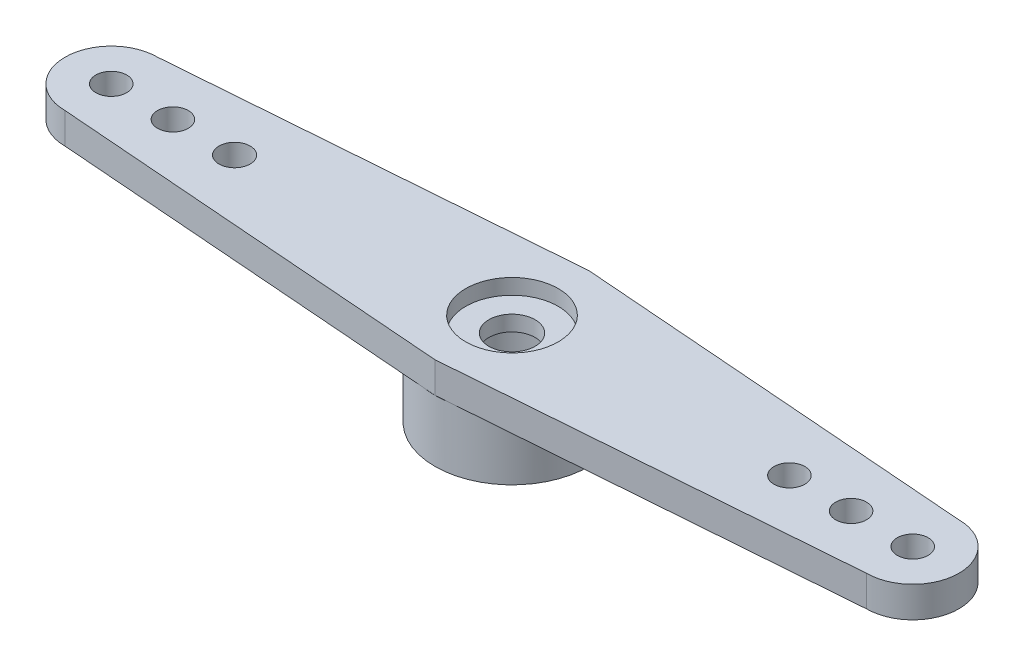
ISO-10303-21;
HEADER;
FILE_DESCRIPTION(('STEP AP214'),'2;1');
FILE_NAME('part.step','',(''),(''),'','','');
FILE_SCHEMA(('AUTOMOTIVE_DESIGN { 1 0 10303 214 1 1 1 1 }'));
ENDSEC;
DATA;
#1=APPLICATION_CONTEXT('core data for automotive mechanical design processes');
#2=APPLICATION_PROTOCOL_DEFINITION('international standard','automotive_design',2000,#1);
#3=PRODUCT_CONTEXT('',#1,'mechanical');
#4=PRODUCT('Part','Part','',(#3));
#5=PRODUCT_RELATED_PRODUCT_CATEGORY('part','',(#4));
#6=PRODUCT_DEFINITION_FORMATION('','',#4);
#7=PRODUCT_DEFINITION_CONTEXT('part definition',#1,'design');
#8=PRODUCT_DEFINITION('design','',#6,#7);
#9=PRODUCT_DEFINITION_SHAPE('','',#8);
#10=(LENGTH_UNIT() NAMED_UNIT(*) SI_UNIT(.MILLI.,.METRE.));
#11=(NAMED_UNIT(*) PLANE_ANGLE_UNIT() SI_UNIT($,.RADIAN.));
#12=(NAMED_UNIT(*) SI_UNIT($,.STERADIAN.) SOLID_ANGLE_UNIT());
#13=UNCERTAINTY_MEASURE_WITH_UNIT(LENGTH_MEASURE(1.E-05),#10,'distance_accuracy_value','');
#14=(GEOMETRIC_REPRESENTATION_CONTEXT(3) GLOBAL_UNCERTAINTY_ASSIGNED_CONTEXT((#13)) GLOBAL_UNIT_ASSIGNED_CONTEXT((#10,
#11,#12)) REPRESENTATION_CONTEXT('',''));
#15=CARTESIAN_POINT('',(0.,0.,0.));
#16=DIRECTION('',(0.,0.,1.));
#17=DIRECTION('',(1.,0.,0.));
#18=AXIS2_PLACEMENT_3D('',#15,#16,#17);
#19=CARTESIAN_POINT('',(0.,2.,0.));
#20=DIRECTION('',(0.,-1.,0.));
#21=DIRECTION('',(0.,0.,-1.));
#22=AXIS2_PLACEMENT_3D('',#19,#20,#21);
#23=CYLINDRICAL_SURFACE('',#22,0.75);
#24=CARTESIAN_POINT('',(0.,0.,0.));
#25=DIRECTION('',(0.,1.,0.));
#26=DIRECTION('',(0.,0.,1.));
#27=AXIS2_PLACEMENT_3D('',#24,#25,#26);
#28=CIRCLE('',#27,0.75);
#29=CARTESIAN_POINT('',(0.,0.,0.75));
#30=VERTEX_POINT('',#29);
#31=EDGE_CURVE('E174',#30,#30,#28,.T.);
#32=ORIENTED_EDGE('',*,*,#31,.F.);
#33=EDGE_LOOP('',(#32));
#34=FACE_BOUND('',#33,.T.);
#35=CARTESIAN_POINT('',(0.,0.5,0.));
#36=DIRECTION('',(0.,1.,0.));
#37=DIRECTION('',(0.,0.,1.));
#38=AXIS2_PLACEMENT_3D('',#35,#36,#37);
#39=CIRCLE('',#38,0.75);
#40=CARTESIAN_POINT('',(0.,0.5,0.75));
#41=VERTEX_POINT('',#40);
#42=EDGE_CURVE('E167',#41,#41,#39,.T.);
#43=ORIENTED_EDGE('',*,*,#42,.T.);
#44=EDGE_LOOP('',(#43));
#45=FACE_BOUND('',#44,.T.);
#46=ADVANCED_FACE('F41',(#34,#45),#23,.F.);
#47=CARTESIAN_POINT('',(0.,0.,0.));
#48=DIRECTION('',(0.,1.,0.));
#49=DIRECTION('',(0.,0.,1.));
#50=AXIS2_PLACEMENT_3D('',#47,#48,#49);
#51=PLANE('',#50);
#52=CARTESIAN_POINT('',(13.,0.,0.));
#53=DIRECTION('',(0.,1.,0.));
#54=DIRECTION('',(0.,0.,1.));
#55=AXIS2_PLACEMENT_3D('',#52,#53,#54);
#56=CIRCLE('',#55,0.500000000000001);
#57=CARTESIAN_POINT('',(13.,0.,0.499999999999996));
#58=VERTEX_POINT('',#57);
#59=EDGE_CURVE('E581',#58,#58,#56,.T.);
#60=ORIENTED_EDGE('',*,*,#59,.T.);
#61=EDGE_LOOP('',(#60));
#62=FACE_BOUND('',#61,.T.);
#63=CARTESIAN_POINT('',(11.,0.,0.));
#64=DIRECTION('',(0.,1.,0.));
#65=DIRECTION('',(0.,0.,1.));
#66=AXIS2_PLACEMENT_3D('',#63,#64,#65);
#67=CIRCLE('',#66,0.500000000000001);
#68=CARTESIAN_POINT('',(11.,0.,0.500000000000001));
#69=VERTEX_POINT('',#68);
#70=EDGE_CURVE('E281',#69,#69,#67,.T.);
#71=ORIENTED_EDGE('',*,*,#70,.T.);
#72=EDGE_LOOP('',(#71));
#73=FACE_BOUND('',#72,.T.);
#74=CARTESIAN_POINT('',(9.,0.,0.));
#75=DIRECTION('',(0.,1.,0.));
#76=DIRECTION('',(0.,0.,1.));
#77=AXIS2_PLACEMENT_3D('',#74,#75,#76);
#78=CIRCLE('',#77,0.500000000000001);
#79=CARTESIAN_POINT('',(9.,0.,0.500000000000001));
#80=VERTEX_POINT('',#79);
#81=EDGE_CURVE('E582',#80,#80,#78,.T.);
#82=ORIENTED_EDGE('',*,*,#81,.T.);
#83=EDGE_LOOP('',(#82));
#84=FACE_BOUND('',#83,.T.);
#85=DIRECTION('',(-0.997054485501582,0.,0.0766964988847373));
#86=VECTOR('',#85,1.);
#87=CARTESIAN_POINT('',(0.191176470588236,0.,2.48529411764706));
#88=LINE('',#87,#86);
#89=CARTESIAN_POINT('',(13.,0.,1.5));
#90=VERTEX_POINT('',#89);
#91=CARTESIAN_POINT('',(0.382352941176476,0.,2.47058823529412));
#92=VERTEX_POINT('',#91);
#93=EDGE_CURVE('E119',#90,#92,#88,.T.);
#94=ORIENTED_EDGE('',*,*,#93,.T.);
#95=CARTESIAN_POINT('',(0.,0.,0.));
#96=DIRECTION('',(0.,1.,0.));
#97=DIRECTION('',(0.,0.,1.));
#98=AXIS2_PLACEMENT_3D('',#95,#96,#97);
#99=CIRCLE('',#98,2.5);
#100=CARTESIAN_POINT('',(0.382352941176478,0.,-2.47058823529412));
#101=VERTEX_POINT('',#100);
#102=EDGE_CURVE('E11',#92,#101,#99,.T.);
#103=ORIENTED_EDGE('',*,*,#102,.T.);
#104=DIRECTION('',(0.997054485501582,0.,0.0766964988847366));
#105=VECTOR('',#104,1.);
#106=CARTESIAN_POINT('',(0.191176470588234,0.,-2.48529411764706));
#107=LINE('',#106,#105);
#108=CARTESIAN_POINT('',(13.,0.,-1.50000000000001));
#109=VERTEX_POINT('',#108);
#110=EDGE_CURVE('E90',#101,#109,#107,.T.);
#111=ORIENTED_EDGE('',*,*,#110,.T.);
#112=CARTESIAN_POINT('',(13.,0.,0.));
#113=DIRECTION('',(0.,1.,0.));
#114=DIRECTION('',(0.,0.,1.));
#115=AXIS2_PLACEMENT_3D('',#112,#113,#114);
#116=CIRCLE('',#115,1.5);
#117=EDGE_CURVE('E153',#90,#109,#116,.T.);
#118=ORIENTED_EDGE('',*,*,#117,.F.);
#119=EDGE_LOOP('',(#94,#103,#111,#118));
#120=FACE_BOUND('',#119,.T.);
#121=ADVANCED_FACE('F239',(#62,#73,#84,#120),#51,.F.);
#122=CARTESIAN_POINT('',(-0.191176470588235,1.,-2.48529411764706));
#123=DIRECTION('',(0.0766964988847371,0.,0.997054485501582));
#124=DIRECTION('',(0.997054485501582,0.,-0.0766964988847371));
#125=AXIS2_PLACEMENT_3D('',#122,#123,#124);
#126=PLANE('',#125);
#127=DIRECTION('',(-0.997054485501582,0.,0.0766964988847371));
#128=VECTOR('',#127,1.);
#129=CARTESIAN_POINT('',(-0.191176470588235,0.,-2.48529411764706));
#130=LINE('',#129,#128);
#131=CARTESIAN_POINT('',(0.,0.,-2.5));
#132=VERTEX_POINT('',#131);
#133=CARTESIAN_POINT('',(-0.382352941176479,0.,-2.47058823529412));
#134=VERTEX_POINT('',#133);
#135=EDGE_CURVE('E141',#132,#134,#130,.T.);
#136=ORIENTED_EDGE('',*,*,#135,.T.);
#137=CARTESIAN_POINT('',(-13.,0.,-1.5));
#138=VERTEX_POINT('',#137);
#139=EDGE_CURVE('E145',#134,#138,#130,.T.);
#140=ORIENTED_EDGE('',*,*,#139,.T.);
#141=DIRECTION('',(0.,-1.,0.));
#142=VECTOR('',#141,1.);
#143=CARTESIAN_POINT('',(-13.,1.,-1.5));
#144=LINE('',#143,#142);
#145=CARTESIAN_POINT('',(-13.,1.,-1.5));
#146=VERTEX_POINT('',#145);
#147=EDGE_CURVE('E165',#146,#138,#144,.T.);
#148=ORIENTED_EDGE('',*,*,#147,.F.);
#149=DIRECTION('',(-0.997054485501582,0.,0.0766964988847371));
#150=VECTOR('',#149,1.);
#151=CARTESIAN_POINT('',(-0.191176470588235,1.,-2.48529411764706));
#152=LINE('',#151,#150);
#153=CARTESIAN_POINT('',(0.,1.,-2.5));
#154=VERTEX_POINT('',#153);
#155=EDGE_CURVE('E158',#154,#146,#152,.T.);
#156=ORIENTED_EDGE('',*,*,#155,.F.);
#157=DIRECTION('',(0.,-1.,0.));
#158=VECTOR('',#157,1.);
#159=CARTESIAN_POINT('',(0.,1.,-2.5));
#160=LINE('',#159,#158);
#161=EDGE_CURVE('E68',#154,#132,#160,.T.);
#162=ORIENTED_EDGE('',*,*,#161,.T.);
#163=EDGE_LOOP('',(#136,#140,#148,#156,#162));
#164=FACE_BOUND('',#163,.T.);
#165=ADVANCED_FACE('F43',(#164),#126,.F.);
#166=CARTESIAN_POINT('',(-13.,1.,0.));
#167=DIRECTION('',(0.,-1.,0.));
#168=DIRECTION('',(0.,0.,-1.));
#169=AXIS2_PLACEMENT_3D('',#166,#167,#168);
#170=CYLINDRICAL_SURFACE('',#169,1.5);
#171=CARTESIAN_POINT('',(-13.,0.,0.));
#172=DIRECTION('',(0.,1.,0.));
#173=DIRECTION('',(0.,0.,1.));
#174=AXIS2_PLACEMENT_3D('',#171,#172,#173);
#175=CIRCLE('',#174,1.5);
#176=CARTESIAN_POINT('',(-13.,0.,1.5));
#177=VERTEX_POINT('',#176);
#178=EDGE_CURVE('E144',#138,#177,#175,.T.);
#179=ORIENTED_EDGE('',*,*,#178,.T.);
#180=DIRECTION('',(0.,-1.,0.));
#181=VECTOR('',#180,1.);
#182=CARTESIAN_POINT('',(-13.,1.,1.5));
#183=LINE('',#182,#181);
#184=CARTESIAN_POINT('',(-13.,1.,1.5));
#185=VERTEX_POINT('',#184);
#186=EDGE_CURVE('E162',#185,#177,#183,.T.);
#187=ORIENTED_EDGE('',*,*,#186,.F.);
#188=CARTESIAN_POINT('',(-13.,1.,0.));
#189=DIRECTION('',(0.,1.,0.));
#190=DIRECTION('',(0.,0.,1.));
#191=AXIS2_PLACEMENT_3D('',#188,#189,#190);
#192=CIRCLE('',#191,1.5);
#193=EDGE_CURVE('E99',#146,#185,#192,.T.);
#194=ORIENTED_EDGE('',*,*,#193,.F.);
#195=ORIENTED_EDGE('',*,*,#147,.T.);
#196=EDGE_LOOP('',(#179,#187,#194,#195));
#197=FACE_BOUND('',#196,.T.);
#198=ADVANCED_FACE('F206',(#197),#170,.T.);
#199=CARTESIAN_POINT('',(-0.191176470588235,1.,2.48529411764706));
#200=DIRECTION('',(-0.0766964988847371,0.,0.997054485501582));
#201=DIRECTION('',(0.997054485501582,0.,0.0766964988847371));
#202=AXIS2_PLACEMENT_3D('',#199,#200,#201);
#203=PLANE('',#202);
#204=DIRECTION('',(-0.997054485501582,0.,-0.0766964988847371));
#205=VECTOR('',#204,1.);
#206=CARTESIAN_POINT('',(-0.191176470588235,0.,2.48529411764706));
#207=LINE('',#206,#205);
#208=CARTESIAN_POINT('',(0.,0.,2.5));
#209=VERTEX_POINT('',#208);
#210=CARTESIAN_POINT('',(-0.382352941176479,0.,2.47058823529412));
#211=VERTEX_POINT('',#210);
#212=EDGE_CURVE('E149',#209,#211,#207,.T.);
#213=ORIENTED_EDGE('',*,*,#212,.F.);
#214=DIRECTION('',(0.,-1.,0.));
#215=VECTOR('',#214,1.);
#216=CARTESIAN_POINT('',(0.,1.,2.5));
#217=LINE('',#216,#215);
#218=CARTESIAN_POINT('',(0.,1.,2.5));
#219=VERTEX_POINT('',#218);
#220=EDGE_CURVE('E122',#219,#209,#217,.T.);
#221=ORIENTED_EDGE('',*,*,#220,.F.);
#222=DIRECTION('',(-0.997054485501582,0.,-0.0766964988847371));
#223=VECTOR('',#222,1.);
#224=CARTESIAN_POINT('',(-0.191176470588235,1.,2.48529411764706));
#225=LINE('',#224,#223);
#226=EDGE_CURVE('E135',#219,#185,#225,.T.);
#227=ORIENTED_EDGE('',*,*,#226,.T.);
#228=ORIENTED_EDGE('',*,*,#186,.T.);
#229=EDGE_CURVE('E148',#211,#177,#207,.T.);
#230=ORIENTED_EDGE('',*,*,#229,.F.);
#231=EDGE_LOOP('',(#213,#221,#227,#228,#230));
#232=FACE_BOUND('',#231,.T.);
#233=ADVANCED_FACE('F211',(#232),#203,.T.);
#234=CARTESIAN_POINT('',(0.191176470588236,1.,2.48529411764706));
#235=DIRECTION('',(0.0766964988847373,0.,0.997054485501581));
#236=DIRECTION('',(0.997054485501582,0.,-0.0766964988847373));
#237=AXIS2_PLACEMENT_3D('',#234,#235,#236);
#238=PLANE('',#237);
#239=ORIENTED_EDGE('',*,*,#93,.F.);
#240=DIRECTION('',(0.,-1.,0.));
#241=VECTOR('',#240,1.);
#242=CARTESIAN_POINT('',(13.,1.,1.5));
#243=LINE('',#242,#241);
#244=CARTESIAN_POINT('',(13.,1.,1.5));
#245=VERTEX_POINT('',#244);
#246=EDGE_CURVE('E111',#245,#90,#243,.T.);
#247=ORIENTED_EDGE('',*,*,#246,.F.);
#248=DIRECTION('',(-0.997054485501582,0.,0.0766964988847373));
#249=VECTOR('',#248,1.);
#250=CARTESIAN_POINT('',(0.191176470588236,1.,2.48529411764706));
#251=LINE('',#250,#249);
#252=EDGE_CURVE('E116',#245,#219,#251,.T.);
#253=ORIENTED_EDGE('',*,*,#252,.T.);
#254=ORIENTED_EDGE('',*,*,#220,.T.);
#255=EDGE_CURVE('E151',#92,#209,#88,.T.);
#256=ORIENTED_EDGE('',*,*,#255,.F.);
#257=EDGE_LOOP('',(#239,#247,#253,#254,#256));
#258=FACE_BOUND('',#257,.T.);
#259=ADVANCED_FACE('F113',(#258),#238,.T.);
#260=CARTESIAN_POINT('',(13.,1.,0.));
#261=DIRECTION('',(0.,-1.,0.));
#262=DIRECTION('',(0.,0.,-1.));
#263=AXIS2_PLACEMENT_3D('',#260,#261,#262);
#264=CYLINDRICAL_SURFACE('',#263,1.5);
#265=ORIENTED_EDGE('',*,*,#117,.T.);
#266=DIRECTION('',(0.,-1.,0.));
#267=VECTOR('',#266,1.);
#268=CARTESIAN_POINT('',(13.,1.,-1.50000000000001));
#269=LINE('',#268,#267);
#270=CARTESIAN_POINT('',(13.,1.,-1.50000000000001));
#271=VERTEX_POINT('',#270);
#272=EDGE_CURVE('E123',#271,#109,#269,.T.);
#273=ORIENTED_EDGE('',*,*,#272,.F.);
#274=CARTESIAN_POINT('',(13.,1.,0.));
#275=DIRECTION('',(0.,1.,0.));
#276=DIRECTION('',(0.,0.,1.));
#277=AXIS2_PLACEMENT_3D('',#274,#275,#276);
#278=CIRCLE('',#277,1.5);
#279=EDGE_CURVE('E126',#245,#271,#278,.T.);
#280=ORIENTED_EDGE('',*,*,#279,.F.);
#281=ORIENTED_EDGE('',*,*,#246,.T.);
#282=EDGE_LOOP('',(#265,#273,#280,#281));
#283=FACE_BOUND('',#282,.T.);
#284=ADVANCED_FACE('F127',(#283),#264,.T.);
#285=CARTESIAN_POINT('',(0.191176470588234,1.,-2.48529411764706));
#286=DIRECTION('',(0.0766964988847366,0.,-0.997054485501582));
#287=DIRECTION('',(-0.997054485501582,0.,-0.0766964988847366));
#288=AXIS2_PLACEMENT_3D('',#285,#286,#287);
#289=PLANE('',#288);
#290=EDGE_CURVE('E155',#132,#101,#107,.T.);
#291=ORIENTED_EDGE('',*,*,#290,.F.);
#292=ORIENTED_EDGE('',*,*,#161,.F.);
#293=DIRECTION('',(0.997054485501582,0.,0.0766964988847366));
#294=VECTOR('',#293,1.);
#295=CARTESIAN_POINT('',(0.191176470588234,1.,-2.48529411764706));
#296=LINE('',#295,#294);
#297=EDGE_CURVE('E130',#154,#271,#296,.T.);
#298=ORIENTED_EDGE('',*,*,#297,.T.);
#299=ORIENTED_EDGE('',*,*,#272,.T.);
#300=ORIENTED_EDGE('',*,*,#110,.F.);
#301=EDGE_LOOP('',(#291,#292,#298,#299,#300));
#302=FACE_BOUND('',#301,.T.);
#303=ADVANCED_FACE('F236',(#302),#289,.T.);
#304=CARTESIAN_POINT('',(0.,1.,0.));
#305=DIRECTION('',(0.,1.,0.));
#306=DIRECTION('',(0.,0.,1.));
#307=AXIS2_PLACEMENT_3D('',#304,#305,#306);
#308=PLANE('',#307);
#309=CARTESIAN_POINT('',(-11.,1.,0.));
#310=DIRECTION('',(0.,1.,0.));
#311=DIRECTION('',(0.,0.,1.));
#312=AXIS2_PLACEMENT_3D('',#309,#310,#311);
#313=CIRCLE('',#312,0.500000000000001);
#314=CARTESIAN_POINT('',(-11.,1.,0.500000000000001));
#315=VERTEX_POINT('',#314);
#316=EDGE_CURVE('E178',#315,#315,#313,.F.);
#317=ORIENTED_EDGE('',*,*,#316,.T.);
#318=EDGE_LOOP('',(#317));
#319=FACE_BOUND('',#318,.T.);
#320=CARTESIAN_POINT('',(-13.,1.,0.));
#321=DIRECTION('',(0.,1.,0.));
#322=DIRECTION('',(0.,0.,1.));
#323=AXIS2_PLACEMENT_3D('',#320,#321,#322);
#324=CIRCLE('',#323,0.500000000000001);
#325=CARTESIAN_POINT('',(-13.,1.,0.500000000000001));
#326=VERTEX_POINT('',#325);
#327=EDGE_CURVE('E277',#326,#326,#324,.F.);
#328=ORIENTED_EDGE('',*,*,#327,.T.);
#329=EDGE_LOOP('',(#328));
#330=FACE_BOUND('',#329,.T.);
#331=CARTESIAN_POINT('',(13.,1.,0.));
#332=DIRECTION('',(0.,1.,0.));
#333=DIRECTION('',(0.,0.,1.));
#334=AXIS2_PLACEMENT_3D('',#331,#332,#333);
#335=CIRCLE('',#334,0.500000000000001);
#336=CARTESIAN_POINT('',(13.,1.,0.499999999999996));
#337=VERTEX_POINT('',#336);
#338=EDGE_CURVE('E45',#337,#337,#335,.F.);
#339=ORIENTED_EDGE('',*,*,#338,.T.);
#340=EDGE_LOOP('',(#339));
#341=FACE_BOUND('',#340,.T.);
#342=CARTESIAN_POINT('',(11.,1.,0.));
#343=DIRECTION('',(0.,1.,0.));
#344=DIRECTION('',(0.,0.,1.));
#345=AXIS2_PLACEMENT_3D('',#342,#343,#344);
#346=CIRCLE('',#345,0.500000000000001);
#347=CARTESIAN_POINT('',(11.,1.,0.500000000000001));
#348=VERTEX_POINT('',#347);
#349=EDGE_CURVE('E177',#348,#348,#346,.F.);
#350=ORIENTED_EDGE('',*,*,#349,.T.);
#351=EDGE_LOOP('',(#350));
#352=FACE_BOUND('',#351,.T.);
#353=CARTESIAN_POINT('',(9.,1.,0.));
#354=DIRECTION('',(0.,1.,0.));
#355=DIRECTION('',(0.,0.,1.));
#356=AXIS2_PLACEMENT_3D('',#353,#354,#355);
#357=CIRCLE('',#356,0.500000000000001);
#358=CARTESIAN_POINT('',(9.,1.,0.500000000000001));
#359=VERTEX_POINT('',#358);
#360=EDGE_CURVE('E175',#359,#359,#357,.F.);
#361=ORIENTED_EDGE('',*,*,#360,.T.);
#362=EDGE_LOOP('',(#361));
#363=FACE_BOUND('',#362,.T.);
#364=CARTESIAN_POINT('',(-9.,1.,0.));
#365=DIRECTION('',(0.,1.,0.));
#366=DIRECTION('',(0.,0.,1.));
#367=AXIS2_PLACEMENT_3D('',#364,#365,#366);
#368=CIRCLE('',#367,0.506721331634058);
#369=CARTESIAN_POINT('',(-9.,1.,0.506721331634058));
#370=VERTEX_POINT('',#369);
#371=EDGE_CURVE('E274',#370,#370,#368,.F.);
#372=ORIENTED_EDGE('',*,*,#371,.T.);
#373=EDGE_LOOP('',(#372));
#374=FACE_BOUND('',#373,.T.);
#375=CARTESIAN_POINT('',(0.,1.,0.));
#376=DIRECTION('',(0.,1.,0.));
#377=DIRECTION('',(0.,0.,1.));
#378=AXIS2_PLACEMENT_3D('',#375,#376,#377);
#379=CIRCLE('',#378,1.5);
#380=CARTESIAN_POINT('',(0.,1.,1.5));
#381=VERTEX_POINT('',#380);
#382=EDGE_CURVE('E170',#381,#381,#379,.F.);
#383=ORIENTED_EDGE('',*,*,#382,.T.);
#384=EDGE_LOOP('',(#383));
#385=FACE_BOUND('',#384,.T.);
#386=ORIENTED_EDGE('',*,*,#155,.T.);
#387=ORIENTED_EDGE('',*,*,#193,.T.);
#388=ORIENTED_EDGE('',*,*,#226,.F.);
#389=ORIENTED_EDGE('',*,*,#252,.F.);
#390=ORIENTED_EDGE('',*,*,#279,.T.);
#391=ORIENTED_EDGE('',*,*,#297,.F.);
#392=EDGE_LOOP('',(#386,#387,#388,#389,#390,#391));
#393=FACE_BOUND('',#392,.T.);
#394=ADVANCED_FACE('F133',(#319,#330,#341,#352,#363,#374,#385,#393),#308,.T.);
#395=CARTESIAN_POINT('',(-11.,0.,0.));
#396=DIRECTION('',(0.,1.,0.));
#397=DIRECTION('',(0.,0.,1.));
#398=AXIS2_PLACEMENT_3D('',#395,#396,#397);
#399=CIRCLE('',#398,0.500000000000001);
#400=CARTESIAN_POINT('',(-11.,0.,0.500000000000001));
#401=VERTEX_POINT('',#400);
#402=EDGE_CURVE('E265',#401,#401,#399,.T.);
#403=ORIENTED_EDGE('',*,*,#402,.T.);
#404=EDGE_LOOP('',(#403));
#405=FACE_BOUND('',#404,.T.);
#406=CARTESIAN_POINT('',(-13.,0.,0.));
#407=DIRECTION('',(0.,1.,0.));
#408=DIRECTION('',(0.,0.,1.));
#409=AXIS2_PLACEMENT_3D('',#406,#407,#408);
#410=CIRCLE('',#409,0.500000000000001);
#411=CARTESIAN_POINT('',(-13.,0.,0.500000000000001));
#412=VERTEX_POINT('',#411);
#413=EDGE_CURVE('E269',#412,#412,#410,.T.);
#414=ORIENTED_EDGE('',*,*,#413,.T.);
#415=EDGE_LOOP('',(#414));
#416=FACE_BOUND('',#415,.T.);
#417=CARTESIAN_POINT('',(-9.,0.,0.));
#418=DIRECTION('',(0.,1.,0.));
#419=DIRECTION('',(0.,0.,1.));
#420=AXIS2_PLACEMENT_3D('',#417,#418,#419);
#421=CIRCLE('',#420,0.506721331634058);
#422=CARTESIAN_POINT('',(-9.,0.,0.506721331634058));
#423=VERTEX_POINT('',#422);
#424=EDGE_CURVE('E272',#423,#423,#421,.T.);
#425=ORIENTED_EDGE('',*,*,#424,.T.);
#426=EDGE_LOOP('',(#425));
#427=FACE_BOUND('',#426,.T.);
#428=ORIENTED_EDGE('',*,*,#139,.F.);
#429=EDGE_CURVE('E50',#134,#211,#99,.T.);
#430=ORIENTED_EDGE('',*,*,#429,.T.);
#431=ORIENTED_EDGE('',*,*,#229,.T.);
#432=ORIENTED_EDGE('',*,*,#178,.F.);
#433=EDGE_LOOP('',(#428,#430,#431,#432));
#434=FACE_BOUND('',#433,.T.);
#435=ADVANCED_FACE('F234',(#405,#416,#427,#434),#51,.F.);
#436=CARTESIAN_POINT('',(0.,0.,0.));
#437=DIRECTION('',(0.,1.,0.));
#438=DIRECTION('',(0.,0.,1.));
#439=AXIS2_PLACEMENT_3D('',#436,#437,#438);
#440=PLANE('',#439);
#441=ORIENTED_EDGE('',*,*,#135,.F.);
#442=EDGE_CURVE('E229',#132,#134,#99,.T.);
#443=ORIENTED_EDGE('',*,*,#442,.T.);
#444=EDGE_LOOP('',(#441,#443));
#445=FACE_BOUND('',#444,.T.);
#446=ADVANCED_FACE('F233',(#445),#440,.T.);
#447=EDGE_CURVE('E52',#101,#132,#99,.T.);
#448=ORIENTED_EDGE('',*,*,#447,.T.);
#449=ORIENTED_EDGE('',*,*,#290,.T.);
#450=EDGE_LOOP('',(#448,#449));
#451=FACE_BOUND('',#450,.T.);
#452=ADVANCED_FACE('F238',(#451),#440,.T.);
#453=EDGE_CURVE('E202',#209,#92,#99,.T.);
#454=ORIENTED_EDGE('',*,*,#453,.T.);
#455=ORIENTED_EDGE('',*,*,#255,.T.);
#456=EDGE_LOOP('',(#454,#455));
#457=FACE_BOUND('',#456,.T.);
#458=ADVANCED_FACE('F338',(#457),#440,.T.);
#459=CARTESIAN_POINT('',(0.,-2.,0.));
#460=DIRECTION('',(0.,1.,0.));
#461=DIRECTION('',(0.,0.,1.));
#462=AXIS2_PLACEMENT_3D('',#459,#460,#461);
#463=CYLINDRICAL_SURFACE('',#462,2.5);
#464=CARTESIAN_POINT('',(0.,-2.,0.));
#465=DIRECTION('',(0.,1.,0.));
#466=DIRECTION('',(0.,0.,1.));
#467=AXIS2_PLACEMENT_3D('',#464,#465,#466);
#468=CIRCLE('',#467,2.5);
#469=CARTESIAN_POINT('',(0.,-2.,2.5));
#470=VERTEX_POINT('',#469);
#471=EDGE_CURVE('E200',#470,#470,#468,.T.);
#472=ORIENTED_EDGE('',*,*,#471,.T.);
#473=EDGE_LOOP('',(#472));
#474=FACE_BOUND('',#473,.T.);
#475=ORIENTED_EDGE('',*,*,#453,.F.);
#476=EDGE_CURVE('E59',#211,#209,#99,.T.);
#477=ORIENTED_EDGE('',*,*,#476,.F.);
#478=ORIENTED_EDGE('',*,*,#429,.F.);
#479=ORIENTED_EDGE('',*,*,#442,.F.);
#480=ORIENTED_EDGE('',*,*,#447,.F.);
#481=ORIENTED_EDGE('',*,*,#102,.F.);
#482=EDGE_LOOP('',(#475,#477,#478,#479,#480,#481));
#483=FACE_BOUND('',#482,.T.);
#484=ADVANCED_FACE('F227',(#474,#483),#463,.T.);
#485=CARTESIAN_POINT('',(0.,-2.,0.));
#486=DIRECTION('',(0.,1.,0.));
#487=DIRECTION('',(0.,0.,1.));
#488=AXIS2_PLACEMENT_3D('',#485,#486,#487);
#489=PLANE('',#488);
#490=CARTESIAN_POINT('',(0.,-2.,0.));
#491=DIRECTION('',(0.,1.,0.));
#492=DIRECTION('',(0.,0.,1.));
#493=AXIS2_PLACEMENT_3D('',#490,#491,#492);
#494=CIRCLE('',#493,1.5);
#495=CARTESIAN_POINT('',(0.,-2.,1.5));
#496=VERTEX_POINT('',#495);
#497=EDGE_CURVE('E195',#496,#496,#494,.T.);
#498=ORIENTED_EDGE('',*,*,#497,.T.);
#499=EDGE_LOOP('',(#498));
#500=FACE_BOUND('',#499,.T.);
#501=ORIENTED_EDGE('',*,*,#471,.F.);
#502=EDGE_LOOP('',(#501));
#503=FACE_BOUND('',#502,.T.);
#504=ADVANCED_FACE('F332',(#500,#503),#489,.F.);
#505=ORIENTED_EDGE('',*,*,#476,.T.);
#506=ORIENTED_EDGE('',*,*,#212,.T.);
#507=EDGE_LOOP('',(#505,#506));
#508=FACE_BOUND('',#507,.T.);
#509=ADVANCED_FACE('F260',(#508),#440,.T.);
#510=CARTESIAN_POINT('',(0.,-2.,0.));
#511=DIRECTION('',(0.,1.,0.));
#512=DIRECTION('',(0.,0.,1.));
#513=AXIS2_PLACEMENT_3D('',#510,#511,#512);
#514=CYLINDRICAL_SURFACE('',#513,1.5);
#515=ORIENTED_EDGE('',*,*,#497,.F.);
#516=EDGE_LOOP('',(#515));
#517=FACE_BOUND('',#516,.T.);
#518=CARTESIAN_POINT('',(0.,0.,0.));
#519=DIRECTION('',(0.,1.,0.));
#520=DIRECTION('',(0.,0.,1.));
#521=AXIS2_PLACEMENT_3D('',#518,#519,#520);
#522=CIRCLE('',#521,1.5);
#523=CARTESIAN_POINT('',(0.,0.,1.5));
#524=VERTEX_POINT('',#523);
#525=EDGE_CURVE('E194',#524,#524,#522,.T.);
#526=ORIENTED_EDGE('',*,*,#525,.T.);
#527=EDGE_LOOP('',(#526));
#528=FACE_BOUND('',#527,.T.);
#529=ADVANCED_FACE('F327',(#517,#528),#514,.F.);
#530=CARTESIAN_POINT('',(0.,0.,0.));
#531=DIRECTION('',(0.,1.,0.));
#532=DIRECTION('',(0.,0.,1.));
#533=AXIS2_PLACEMENT_3D('',#530,#531,#532);
#534=PLANE('',#533);
#535=ORIENTED_EDGE('',*,*,#31,.T.);
#536=EDGE_LOOP('',(#535));
#537=FACE_BOUND('',#536,.T.);
#538=ORIENTED_EDGE('',*,*,#525,.F.);
#539=EDGE_LOOP('',(#538));
#540=FACE_BOUND('',#539,.T.);
#541=ADVANCED_FACE('F322',(#537,#540),#534,.F.);
#542=CARTESIAN_POINT('',(0.,2.5,0.));
#543=DIRECTION('',(0.,-1.,0.));
#544=DIRECTION('',(0.,0.,-1.));
#545=AXIS2_PLACEMENT_3D('',#542,#543,#544);
#546=CYLINDRICAL_SURFACE('',#545,1.5);
#547=ORIENTED_EDGE('',*,*,#382,.F.);
#548=EDGE_LOOP('',(#547));
#549=FACE_BOUND('',#548,.T.);
#550=CARTESIAN_POINT('',(0.,0.5,0.));
#551=DIRECTION('',(0.,1.,0.));
#552=DIRECTION('',(0.,0.,1.));
#553=AXIS2_PLACEMENT_3D('',#550,#551,#552);
#554=CIRCLE('',#553,1.5);
#555=CARTESIAN_POINT('',(0.,0.5,1.5));
#556=VERTEX_POINT('',#555);
#557=EDGE_CURVE('E171',#556,#556,#554,.T.);
#558=ORIENTED_EDGE('',*,*,#557,.F.);
#559=EDGE_LOOP('',(#558));
#560=FACE_BOUND('',#559,.T.);
#561=ADVANCED_FACE('F319',(#549,#560),#546,.F.);
#562=CARTESIAN_POINT('',(0.,0.5,0.));
#563=DIRECTION('',(0.,1.,0.));
#564=DIRECTION('',(0.,0.,1.));
#565=AXIS2_PLACEMENT_3D('',#562,#563,#564);
#566=PLANE('',#565);
#567=ORIENTED_EDGE('',*,*,#42,.F.);
#568=EDGE_LOOP('',(#567));
#569=FACE_BOUND('',#568,.T.);
#570=ORIENTED_EDGE('',*,*,#557,.T.);
#571=EDGE_LOOP('',(#570));
#572=FACE_BOUND('',#571,.T.);
#573=ADVANCED_FACE('F315',(#569,#572),#566,.T.);
#574=CARTESIAN_POINT('',(-9.,2.,0.));
#575=DIRECTION('',(0.,-1.,0.));
#576=DIRECTION('',(0.,0.,-1.));
#577=AXIS2_PLACEMENT_3D('',#574,#575,#576);
#578=CYLINDRICAL_SURFACE('',#577,0.506721331634058);
#579=ORIENTED_EDGE('',*,*,#371,.F.);
#580=EDGE_LOOP('',(#579));
#581=FACE_BOUND('',#580,.T.);
#582=ORIENTED_EDGE('',*,*,#424,.F.);
#583=EDGE_LOOP('',(#582));
#584=FACE_BOUND('',#583,.T.);
#585=ADVANCED_FACE('F302',(#581,#584),#578,.F.);
#586=CARTESIAN_POINT('',(-13.,2.,0.));
#587=DIRECTION('',(0.,-1.,0.));
#588=DIRECTION('',(0.,0.,-1.));
#589=AXIS2_PLACEMENT_3D('',#586,#587,#588);
#590=CYLINDRICAL_SURFACE('',#589,0.500000000000001);
#591=ORIENTED_EDGE('',*,*,#327,.F.);
#592=EDGE_LOOP('',(#591));
#593=FACE_BOUND('',#592,.T.);
#594=ORIENTED_EDGE('',*,*,#413,.F.);
#595=EDGE_LOOP('',(#594));
#596=FACE_BOUND('',#595,.T.);
#597=ADVANCED_FACE('F293',(#593,#596),#590,.F.);
#598=CARTESIAN_POINT('',(-11.,2.,0.));
#599=DIRECTION('',(0.,-1.,0.));
#600=DIRECTION('',(0.,0.,-1.));
#601=AXIS2_PLACEMENT_3D('',#598,#599,#600);
#602=CYLINDRICAL_SURFACE('',#601,0.500000000000001);
#603=ORIENTED_EDGE('',*,*,#316,.F.);
#604=EDGE_LOOP('',(#603));
#605=FACE_BOUND('',#604,.T.);
#606=ORIENTED_EDGE('',*,*,#402,.F.);
#607=EDGE_LOOP('',(#606));
#608=FACE_BOUND('',#607,.T.);
#609=ADVANCED_FACE('F289',(#605,#608),#602,.F.);
#610=CARTESIAN_POINT('',(9.,2.,0.));
#611=DIRECTION('',(0.,-1.,0.));
#612=DIRECTION('',(0.,0.,-1.));
#613=AXIS2_PLACEMENT_3D('',#610,#611,#612);
#614=CYLINDRICAL_SURFACE('',#613,0.500000000000001);
#615=ORIENTED_EDGE('',*,*,#360,.F.);
#616=EDGE_LOOP('',(#615));
#617=FACE_BOUND('',#616,.T.);
#618=ORIENTED_EDGE('',*,*,#81,.F.);
#619=EDGE_LOOP('',(#618));
#620=FACE_BOUND('',#619,.T.);
#621=ADVANCED_FACE('F292',(#617,#620),#614,.F.);
#622=CARTESIAN_POINT('',(11.,2.,0.));
#623=DIRECTION('',(0.,-1.,0.));
#624=DIRECTION('',(0.,0.,-1.));
#625=AXIS2_PLACEMENT_3D('',#622,#623,#624);
#626=CYLINDRICAL_SURFACE('',#625,0.500000000000001);
#627=ORIENTED_EDGE('',*,*,#349,.F.);
#628=EDGE_LOOP('',(#627));
#629=FACE_BOUND('',#628,.T.);
#630=ORIENTED_EDGE('',*,*,#70,.F.);
#631=EDGE_LOOP('',(#630));
#632=FACE_BOUND('',#631,.T.);
#633=ADVANCED_FACE('F299',(#629,#632),#626,.F.);
#634=CARTESIAN_POINT('',(13.,2.,0.));
#635=DIRECTION('',(0.,-1.,0.));
#636=DIRECTION('',(0.,0.,-1.));
#637=AXIS2_PLACEMENT_3D('',#634,#635,#636);
#638=CYLINDRICAL_SURFACE('',#637,0.500000000000001);
#639=ORIENTED_EDGE('',*,*,#338,.F.);
#640=EDGE_LOOP('',(#639));
#641=FACE_BOUND('',#640,.T.);
#642=ORIENTED_EDGE('',*,*,#59,.F.);
#643=EDGE_LOOP('',(#642));
#644=FACE_BOUND('',#643,.T.);
#645=ADVANCED_FACE('F306',(#641,#644),#638,.F.);
#646=CLOSED_SHELL('',(#46,#121,#165,#198,#233,#259,#284,#303,#394,#435,#446,#452,#458,#484,#504,
#509,#529,#541,#561,#573,#585,#597,#609,#621,#633,#645));
#647=MANIFOLD_SOLID_BREP('B2',#646);
#648=ADVANCED_BREP_SHAPE_REPRESENTATION('',(#18,#647),#14);
#649=SHAPE_DEFINITION_REPRESENTATION(#9,#648);
ENDSEC;
END-ISO-10303-21;
